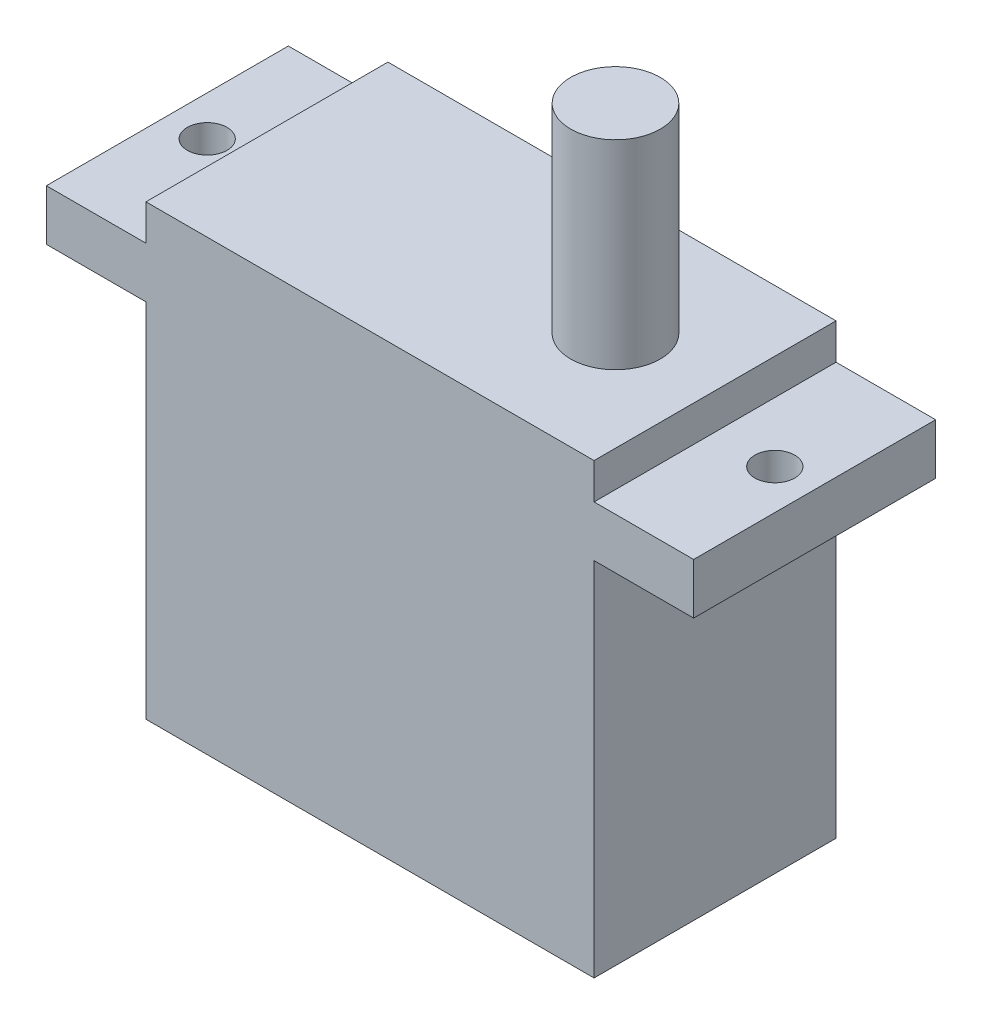
ISO-10303-21;
HEADER;
FILE_DESCRIPTION(('STEP AP214'),'2;1');
FILE_NAME('part.step','',(''),(''),'','','');
FILE_SCHEMA(('AUTOMOTIVE_DESIGN { 1 0 10303 214 1 1 1 1 }'));
ENDSEC;
DATA;
#1=APPLICATION_CONTEXT('core data for automotive mechanical design processes');
#2=APPLICATION_PROTOCOL_DEFINITION('international standard','automotive_design',2000,#1);
#3=PRODUCT_CONTEXT('',#1,'mechanical');
#4=PRODUCT('Part','Part','',(#3));
#5=PRODUCT_RELATED_PRODUCT_CATEGORY('part','',(#4));
#6=PRODUCT_DEFINITION_FORMATION('','',#4);
#7=PRODUCT_DEFINITION_CONTEXT('part definition',#1,'design');
#8=PRODUCT_DEFINITION('design','',#6,#7);
#9=PRODUCT_DEFINITION_SHAPE('','',#8);
#10=(LENGTH_UNIT() NAMED_UNIT(*) SI_UNIT(.MILLI.,.METRE.));
#11=(NAMED_UNIT(*) PLANE_ANGLE_UNIT() SI_UNIT($,.RADIAN.));
#12=(NAMED_UNIT(*) SI_UNIT($,.STERADIAN.) SOLID_ANGLE_UNIT());
#13=UNCERTAINTY_MEASURE_WITH_UNIT(LENGTH_MEASURE(1.E-05),#10,'distance_accuracy_value','');
#14=(GEOMETRIC_REPRESENTATION_CONTEXT(3) GLOBAL_UNCERTAINTY_ASSIGNED_CONTEXT((#13)) GLOBAL_UNIT_ASSIGNED_CONTEXT((#10,
#11,#12)) REPRESENTATION_CONTEXT('',''));
#15=CARTESIAN_POINT('',(0.,0.,0.));
#16=DIRECTION('',(0.,0.,1.));
#17=DIRECTION('',(1.,0.,0.));
#18=AXIS2_PLACEMENT_3D('',#15,#16,#17);
#19=CARTESIAN_POINT('',(-11.25,22.5,6.075));
#20=DIRECTION('',(1.,0.,0.));
#21=DIRECTION('',(0.,0.,-1.));
#22=AXIS2_PLACEMENT_3D('',#19,#20,#21);
#23=PLANE('',#22);
#24=DIRECTION('',(0.,0.,-1.));
#25=VECTOR('',#24,1.);
#26=CARTESIAN_POINT('',(-11.25,20.7,6.075));
#27=LINE('',#26,#25);
#28=CARTESIAN_POINT('',(-11.25,20.7,6.075));
#29=VERTEX_POINT('',#28);
#30=CARTESIAN_POINT('',(-11.25,20.7,-6.07499999999997));
#31=VERTEX_POINT('',#30);
#32=EDGE_CURVE('E147',#29,#31,#27,.T.);
#33=ORIENTED_EDGE('',*,*,#32,.F.);
#34=DIRECTION('',(0.,-1.,0.));
#35=VECTOR('',#34,1.);
#36=CARTESIAN_POINT('',(-11.25,22.5,6.075));
#37=LINE('',#36,#35);
#38=CARTESIAN_POINT('',(-11.25,22.5,6.075));
#39=VERTEX_POINT('',#38);
#40=EDGE_CURVE('E11',#39,#29,#37,.T.);
#41=ORIENTED_EDGE('',*,*,#40,.F.);
#42=DIRECTION('',(0.,0.,1.));
#43=VECTOR('',#42,1.);
#44=CARTESIAN_POINT('',(-11.25,22.5,6.075));
#45=LINE('',#44,#43);
#46=CARTESIAN_POINT('',(-11.25,22.5,-6.075));
#47=VERTEX_POINT('',#46);
#48=EDGE_CURVE('E201',#47,#39,#45,.T.);
#49=ORIENTED_EDGE('',*,*,#48,.F.);
#50=DIRECTION('',(0.,-1.,0.));
#51=VECTOR('',#50,1.);
#52=CARTESIAN_POINT('',(-11.25,22.5,-6.075));
#53=LINE('',#52,#51);
#54=EDGE_CURVE('E220',#47,#31,#53,.T.);
#55=ORIENTED_EDGE('',*,*,#54,.T.);
#56=EDGE_LOOP('',(#33,#41,#49,#55));
#57=FACE_BOUND('',#56,.T.);
#58=ADVANCED_FACE('F43',(#57),#23,.F.);
#59=CARTESIAN_POINT('',(11.25,22.5,6.075));
#60=DIRECTION('',(-1.,0.,0.));
#61=DIRECTION('',(0.,0.,1.));
#62=AXIS2_PLACEMENT_3D('',#59,#60,#61);
#63=PLANE('',#62);
#64=DIRECTION('',(0.,0.,-1.));
#65=VECTOR('',#64,1.);
#66=CARTESIAN_POINT('',(11.25,18.15,6.075));
#67=LINE('',#66,#65);
#68=CARTESIAN_POINT('',(11.25,18.15,6.075));
#69=VERTEX_POINT('',#68);
#70=CARTESIAN_POINT('',(11.25,18.15,-6.07499999999997));
#71=VERTEX_POINT('',#70);
#72=EDGE_CURVE('E178',#69,#71,#67,.T.);
#73=ORIENTED_EDGE('',*,*,#72,.F.);
#74=DIRECTION('',(0.,-1.,0.));
#75=VECTOR('',#74,1.);
#76=CARTESIAN_POINT('',(11.25,22.5,6.075));
#77=LINE('',#76,#75);
#78=CARTESIAN_POINT('',(11.25,0.,6.075));
#79=VERTEX_POINT('',#78);
#80=EDGE_CURVE('E225',#69,#79,#77,.T.);
#81=ORIENTED_EDGE('',*,*,#80,.T.);
#82=DIRECTION('',(0.,0.,-1.));
#83=VECTOR('',#82,1.);
#84=CARTESIAN_POINT('',(11.25,0.,6.075));
#85=LINE('',#84,#83);
#86=CARTESIAN_POINT('',(11.25,0.,-6.07499999999997));
#87=VERTEX_POINT('',#86);
#88=EDGE_CURVE('E215',#79,#87,#85,.T.);
#89=ORIENTED_EDGE('',*,*,#88,.T.);
#90=DIRECTION('',(0.,-1.,0.));
#91=VECTOR('',#90,1.);
#92=CARTESIAN_POINT('',(11.25,22.5,-6.07499999999997));
#93=LINE('',#92,#91);
#94=EDGE_CURVE('E222',#71,#87,#93,.T.);
#95=ORIENTED_EDGE('',*,*,#94,.F.);
#96=EDGE_LOOP('',(#73,#81,#89,#95));
#97=FACE_BOUND('',#96,.T.);
#98=ADVANCED_FACE('F232',(#97),#63,.F.);
#99=CARTESIAN_POINT('',(-11.25,18.15,6.075));
#100=VERTEX_POINT('',#99);
#101=CARTESIAN_POINT('',(-11.25,0.,6.075));
#102=VERTEX_POINT('',#101);
#103=EDGE_CURVE('E51',#100,#102,#37,.T.);
#104=ORIENTED_EDGE('',*,*,#103,.F.);
#105=DIRECTION('',(0.,0.,-1.));
#106=VECTOR('',#105,1.);
#107=CARTESIAN_POINT('',(-11.25,18.15,6.075));
#108=LINE('',#107,#106);
#109=CARTESIAN_POINT('',(-11.25,18.15,-6.075));
#110=VERTEX_POINT('',#109);
#111=EDGE_CURVE('E58',#100,#110,#108,.T.);
#112=ORIENTED_EDGE('',*,*,#111,.T.);
#113=CARTESIAN_POINT('',(-11.25,0.,-6.075));
#114=VERTEX_POINT('',#113);
#115=EDGE_CURVE('E211',#110,#114,#53,.T.);
#116=ORIENTED_EDGE('',*,*,#115,.T.);
#117=DIRECTION('',(0.,0.,1.));
#118=VECTOR('',#117,1.);
#119=CARTESIAN_POINT('',(-11.25,0.,6.075));
#120=LINE('',#119,#118);
#121=EDGE_CURVE('E192',#114,#102,#120,.T.);
#122=ORIENTED_EDGE('',*,*,#121,.T.);
#123=EDGE_LOOP('',(#104,#112,#116,#122));
#124=FACE_BOUND('',#123,.T.);
#125=ADVANCED_FACE('F45',(#124),#23,.F.);
#126=CARTESIAN_POINT('',(11.25,22.5,6.075));
#127=DIRECTION('',(0.,0.,-1.));
#128=DIRECTION('',(-1.,0.,0.));
#129=AXIS2_PLACEMENT_3D('',#126,#127,#128);
#130=PLANE('',#129);
#131=DIRECTION('',(1.,0.,0.));
#132=VECTOR('',#131,1.);
#133=CARTESIAN_POINT('',(11.25,0.,6.075));
#134=LINE('',#133,#132);
#135=EDGE_CURVE('E213',#102,#79,#134,.T.);
#136=ORIENTED_EDGE('',*,*,#135,.T.);
#137=ORIENTED_EDGE('',*,*,#80,.F.);
#138=DIRECTION('',(-1.,0.,0.));
#139=VECTOR('',#138,1.);
#140=CARTESIAN_POINT('',(16.25,18.15,6.075));
#141=LINE('',#140,#139);
#142=CARTESIAN_POINT('',(16.25,18.15,6.075));
#143=VERTEX_POINT('',#142);
#144=EDGE_CURVE('E189',#143,#69,#141,.T.);
#145=ORIENTED_EDGE('',*,*,#144,.F.);
#146=DIRECTION('',(0.,1.,0.));
#147=VECTOR('',#146,1.);
#148=CARTESIAN_POINT('',(16.25,18.15,6.075));
#149=LINE('',#148,#147);
#150=CARTESIAN_POINT('',(16.25,20.7,6.075));
#151=VERTEX_POINT('',#150);
#152=EDGE_CURVE('E174',#143,#151,#149,.T.);
#153=ORIENTED_EDGE('',*,*,#152,.T.);
#154=DIRECTION('',(-1.,0.,0.));
#155=VECTOR('',#154,1.);
#156=CARTESIAN_POINT('',(16.25,20.7,6.075));
#157=LINE('',#156,#155);
#158=CARTESIAN_POINT('',(11.25,20.7,6.075));
#159=VERTEX_POINT('',#158);
#160=EDGE_CURVE('E185',#151,#159,#157,.T.);
#161=ORIENTED_EDGE('',*,*,#160,.T.);
#162=CARTESIAN_POINT('',(11.25,22.5,6.075));
#163=VERTEX_POINT('',#162);
#164=EDGE_CURVE('E226',#163,#159,#77,.T.);
#165=ORIENTED_EDGE('',*,*,#164,.F.);
#166=DIRECTION('',(1.,0.,0.));
#167=VECTOR('',#166,1.);
#168=CARTESIAN_POINT('',(11.25,22.5,6.075));
#169=LINE('',#168,#167);
#170=EDGE_CURVE('E204',#39,#163,#169,.T.);
#171=ORIENTED_EDGE('',*,*,#170,.F.);
#172=ORIENTED_EDGE('',*,*,#40,.T.);
#173=DIRECTION('',(1.,0.,0.));
#174=VECTOR('',#173,1.);
#175=CARTESIAN_POINT('',(-16.25,20.7,6.075));
#176=LINE('',#175,#174);
#177=CARTESIAN_POINT('',(-16.25,20.7,6.075));
#178=VERTEX_POINT('',#177);
#179=EDGE_CURVE('E145',#178,#29,#176,.T.);
#180=ORIENTED_EDGE('',*,*,#179,.F.);
#181=DIRECTION('',(0.,1.,0.));
#182=VECTOR('',#181,1.);
#183=CARTESIAN_POINT('',(-16.25,18.15,6.075));
#184=LINE('',#183,#182);
#185=CARTESIAN_POINT('',(-16.25,18.15,6.075));
#186=VERTEX_POINT('',#185);
#187=EDGE_CURVE('E141',#186,#178,#184,.T.);
#188=ORIENTED_EDGE('',*,*,#187,.F.);
#189=DIRECTION('',(1.,0.,0.));
#190=VECTOR('',#189,1.);
#191=CARTESIAN_POINT('',(-16.25,18.15,6.075));
#192=LINE('',#191,#190);
#193=EDGE_CURVE('E129',#186,#100,#192,.T.);
#194=ORIENTED_EDGE('',*,*,#193,.T.);
#195=ORIENTED_EDGE('',*,*,#103,.T.);
#196=EDGE_LOOP('',(#136,#137,#145,#153,#161,#165,#171,#172,#180,#188,#194,#195));
#197=FACE_BOUND('',#196,.T.);
#198=ADVANCED_FACE('F143',(#197),#130,.F.);
#199=ORIENTED_EDGE('',*,*,#164,.T.);
#200=DIRECTION('',(0.,0.,-1.));
#201=VECTOR('',#200,1.);
#202=CARTESIAN_POINT('',(11.25,20.7,6.075));
#203=LINE('',#202,#201);
#204=CARTESIAN_POINT('',(11.25,20.7,-6.07499999999997));
#205=VERTEX_POINT('',#204);
#206=EDGE_CURVE('E173',#159,#205,#203,.T.);
#207=ORIENTED_EDGE('',*,*,#206,.T.);
#208=CARTESIAN_POINT('',(11.25,22.5,-6.07499999999997));
#209=VERTEX_POINT('',#208);
#210=EDGE_CURVE('E223',#209,#205,#93,.T.);
#211=ORIENTED_EDGE('',*,*,#210,.F.);
#212=DIRECTION('',(0.,0.,-1.));
#213=VECTOR('',#212,1.);
#214=CARTESIAN_POINT('',(11.25,22.5,6.075));
#215=LINE('',#214,#213);
#216=EDGE_CURVE('E207',#163,#209,#215,.T.);
#217=ORIENTED_EDGE('',*,*,#216,.F.);
#218=EDGE_LOOP('',(#199,#207,#211,#217));
#219=FACE_BOUND('',#218,.T.);
#220=ADVANCED_FACE('F255',(#219),#63,.F.);
#221=CARTESIAN_POINT('',(11.25,22.5,-6.07499999999997));
#222=DIRECTION('',(0.,0.,1.));
#223=DIRECTION('',(1.,0.,0.));
#224=AXIS2_PLACEMENT_3D('',#221,#222,#223);
#225=PLANE('',#224);
#226=DIRECTION('',(-1.,0.,0.));
#227=VECTOR('',#226,1.);
#228=CARTESIAN_POINT('',(11.25,0.,-6.07499999999997));
#229=LINE('',#228,#227);
#230=EDGE_CURVE('E205',#87,#114,#229,.T.);
#231=ORIENTED_EDGE('',*,*,#230,.T.);
#232=ORIENTED_EDGE('',*,*,#115,.F.);
#233=DIRECTION('',(1.,0.,0.));
#234=VECTOR('',#233,1.);
#235=CARTESIAN_POINT('',(-16.25,18.15,-6.07499999999997));
#236=LINE('',#235,#234);
#237=CARTESIAN_POINT('',(-16.25,18.15,-6.07499999999997));
#238=VERTEX_POINT('',#237);
#239=EDGE_CURVE('E136',#238,#110,#236,.T.);
#240=ORIENTED_EDGE('',*,*,#239,.F.);
#241=DIRECTION('',(0.,1.,0.));
#242=VECTOR('',#241,1.);
#243=CARTESIAN_POINT('',(-16.25,18.15,-6.07499999999997));
#244=LINE('',#243,#242);
#245=CARTESIAN_POINT('',(-16.25,20.7,-6.07499999999997));
#246=VERTEX_POINT('',#245);
#247=EDGE_CURVE('E152',#238,#246,#244,.T.);
#248=ORIENTED_EDGE('',*,*,#247,.T.);
#249=DIRECTION('',(1.,0.,0.));
#250=VECTOR('',#249,1.);
#251=CARTESIAN_POINT('',(-16.25,20.7,-6.07499999999997));
#252=LINE('',#251,#250);
#253=EDGE_CURVE('E164',#246,#31,#252,.T.);
#254=ORIENTED_EDGE('',*,*,#253,.T.);
#255=ORIENTED_EDGE('',*,*,#54,.F.);
#256=DIRECTION('',(-1.,0.,0.));
#257=VECTOR('',#256,1.);
#258=CARTESIAN_POINT('',(11.25,22.5,-6.07499999999997));
#259=LINE('',#258,#257);
#260=EDGE_CURVE('E209',#209,#47,#259,.T.);
#261=ORIENTED_EDGE('',*,*,#260,.F.);
#262=ORIENTED_EDGE('',*,*,#210,.T.);
#263=DIRECTION('',(-1.,0.,0.));
#264=VECTOR('',#263,1.);
#265=CARTESIAN_POINT('',(16.25,20.7,-6.07499999999997));
#266=LINE('',#265,#264);
#267=CARTESIAN_POINT('',(16.25,20.7,-6.07499999999997));
#268=VERTEX_POINT('',#267);
#269=EDGE_CURVE('E196',#268,#205,#266,.T.);
#270=ORIENTED_EDGE('',*,*,#269,.F.);
#271=DIRECTION('',(0.,1.,0.));
#272=VECTOR('',#271,1.);
#273=CARTESIAN_POINT('',(16.25,18.15,-6.07499999999997));
#274=LINE('',#273,#272);
#275=CARTESIAN_POINT('',(16.25,18.15,-6.07499999999997));
#276=VERTEX_POINT('',#275);
#277=EDGE_CURVE('E181',#276,#268,#274,.T.);
#278=ORIENTED_EDGE('',*,*,#277,.F.);
#279=DIRECTION('',(-1.,0.,0.));
#280=VECTOR('',#279,1.);
#281=CARTESIAN_POINT('',(16.25,18.15,-6.07499999999997));
#282=LINE('',#281,#280);
#283=EDGE_CURVE('E193',#276,#71,#282,.T.);
#284=ORIENTED_EDGE('',*,*,#283,.T.);
#285=ORIENTED_EDGE('',*,*,#94,.T.);
#286=EDGE_LOOP('',(#231,#232,#240,#248,#254,#255,#261,#262,#270,#278,#284,#285));
#287=FACE_BOUND('',#286,.T.);
#288=ADVANCED_FACE('F240',(#287),#225,.F.);
#289=CARTESIAN_POINT('',(0.,22.5,0.));
#290=DIRECTION('',(0.,1.,0.));
#291=DIRECTION('',(0.,0.,1.));
#292=AXIS2_PLACEMENT_3D('',#289,#290,#291);
#293=PLANE('',#292);
#294=CARTESIAN_POINT('',(6.25000000000009,22.5,0.));
#295=DIRECTION('',(0.,1.,0.));
#296=DIRECTION('',(0.,0.,1.));
#297=AXIS2_PLACEMENT_3D('',#294,#295,#296);
#298=CIRCLE('',#297,2.25);
#299=CARTESIAN_POINT('',(6.25000000000009,22.5,2.25));
#300=VERTEX_POINT('',#299);
#301=EDGE_CURVE('E323',#300,#300,#298,.T.);
#302=ORIENTED_EDGE('',*,*,#301,.F.);
#303=EDGE_LOOP('',(#302));
#304=FACE_BOUND('',#303,.T.);
#305=ORIENTED_EDGE('',*,*,#48,.T.);
#306=ORIENTED_EDGE('',*,*,#170,.T.);
#307=ORIENTED_EDGE('',*,*,#216,.T.);
#308=ORIENTED_EDGE('',*,*,#260,.T.);
#309=EDGE_LOOP('',(#305,#306,#307,#308));
#310=FACE_BOUND('',#309,.T.);
#311=ADVANCED_FACE('F260',(#304,#310),#293,.T.);
#312=CARTESIAN_POINT('',(0.,0.,0.));
#313=DIRECTION('',(0.,1.,0.));
#314=DIRECTION('',(0.,0.,1.));
#315=AXIS2_PLACEMENT_3D('',#312,#313,#314);
#316=PLANE('',#315);
#317=ORIENTED_EDGE('',*,*,#121,.F.);
#318=ORIENTED_EDGE('',*,*,#230,.F.);
#319=ORIENTED_EDGE('',*,*,#88,.F.);
#320=ORIENTED_EDGE('',*,*,#135,.F.);
#321=EDGE_LOOP('',(#317,#318,#319,#320));
#322=FACE_BOUND('',#321,.T.);
#323=ADVANCED_FACE('F238',(#322),#316,.F.);
#324=CARTESIAN_POINT('',(16.25,18.15,6.075));
#325=DIRECTION('',(0.,1.,0.));
#326=DIRECTION('',(0.,0.,1.));
#327=AXIS2_PLACEMENT_3D('',#324,#325,#326);
#328=PLANE('',#327);
#329=CARTESIAN_POINT('',(14.25,18.15,0.));
#330=DIRECTION('',(0.,1.,0.));
#331=DIRECTION('',(0.,0.,1.));
#332=AXIS2_PLACEMENT_3D('',#329,#330,#331);
#333=CIRCLE('',#332,1.);
#334=CARTESIAN_POINT('',(14.25,18.15,1.00000000000002));
#335=VERTEX_POINT('',#334);
#336=EDGE_CURVE('E170',#335,#335,#333,.F.);
#337=ORIENTED_EDGE('',*,*,#336,.F.);
#338=EDGE_LOOP('',(#337));
#339=FACE_BOUND('',#338,.T.);
#340=ORIENTED_EDGE('',*,*,#72,.T.);
#341=ORIENTED_EDGE('',*,*,#283,.F.);
#342=DIRECTION('',(0.,0.,-1.));
#343=VECTOR('',#342,1.);
#344=CARTESIAN_POINT('',(16.25,18.15,6.075));
#345=LINE('',#344,#343);
#346=EDGE_CURVE('E183',#143,#276,#345,.T.);
#347=ORIENTED_EDGE('',*,*,#346,.F.);
#348=ORIENTED_EDGE('',*,*,#144,.T.);
#349=EDGE_LOOP('',(#340,#341,#347,#348));
#350=FACE_BOUND('',#349,.T.);
#351=ADVANCED_FACE('F244',(#339,#350),#328,.F.);
#352=CARTESIAN_POINT('',(16.25,20.7,6.075));
#353=DIRECTION('',(0.,1.,0.));
#354=DIRECTION('',(0.,0.,1.));
#355=AXIS2_PLACEMENT_3D('',#352,#353,#354);
#356=PLANE('',#355);
#357=CARTESIAN_POINT('',(14.25,20.7,0.));
#358=DIRECTION('',(0.,1.,0.));
#359=DIRECTION('',(0.,0.,1.));
#360=AXIS2_PLACEMENT_3D('',#357,#358,#359);
#361=CIRCLE('',#360,1.);
#362=CARTESIAN_POINT('',(14.25,20.7,1.00000000000002));
#363=VERTEX_POINT('',#362);
#364=EDGE_CURVE('E163',#363,#363,#361,.T.);
#365=ORIENTED_EDGE('',*,*,#364,.F.);
#366=EDGE_LOOP('',(#365));
#367=FACE_BOUND('',#366,.T.);
#368=ORIENTED_EDGE('',*,*,#206,.F.);
#369=ORIENTED_EDGE('',*,*,#160,.F.);
#370=DIRECTION('',(0.,0.,-1.));
#371=VECTOR('',#370,1.);
#372=CARTESIAN_POINT('',(16.25,20.7,6.075));
#373=LINE('',#372,#371);
#374=EDGE_CURVE('E177',#151,#268,#373,.T.);
#375=ORIENTED_EDGE('',*,*,#374,.T.);
#376=ORIENTED_EDGE('',*,*,#269,.T.);
#377=EDGE_LOOP('',(#368,#369,#375,#376));
#378=FACE_BOUND('',#377,.T.);
#379=ADVANCED_FACE('F253',(#367,#378),#356,.T.);
#380=CARTESIAN_POINT('',(16.25,0.,0.));
#381=DIRECTION('',(-1.,0.,0.));
#382=DIRECTION('',(0.,0.,1.));
#383=AXIS2_PLACEMENT_3D('',#380,#381,#382);
#384=PLANE('',#383);
#385=ORIENTED_EDGE('',*,*,#152,.F.);
#386=ORIENTED_EDGE('',*,*,#346,.T.);
#387=ORIENTED_EDGE('',*,*,#277,.T.);
#388=ORIENTED_EDGE('',*,*,#374,.F.);
#389=EDGE_LOOP('',(#385,#386,#387,#388));
#390=FACE_BOUND('',#389,.T.);
#391=ADVANCED_FACE('F250',(#390),#384,.F.);
#392=CARTESIAN_POINT('',(14.25,15.3215728752538,0.));
#393=DIRECTION('',(0.,1.,0.));
#394=DIRECTION('',(0.,0.,1.));
#395=AXIS2_PLACEMENT_3D('',#392,#393,#394);
#396=CYLINDRICAL_SURFACE('',#395,1.);
#397=ORIENTED_EDGE('',*,*,#336,.T.);
#398=EDGE_LOOP('',(#397));
#399=FACE_BOUND('',#398,.T.);
#400=ORIENTED_EDGE('',*,*,#364,.T.);
#401=EDGE_LOOP('',(#400));
#402=FACE_BOUND('',#401,.T.);
#403=ADVANCED_FACE('F295',(#399,#402),#396,.F.);
#404=CARTESIAN_POINT('',(-16.25,20.7,6.075));
#405=DIRECTION('',(0.,-1.,0.));
#406=DIRECTION('',(0.,0.,-1.));
#407=AXIS2_PLACEMENT_3D('',#404,#405,#406);
#408=PLANE('',#407);
#409=CARTESIAN_POINT('',(-14.25,20.7,0.));
#410=DIRECTION('',(0.,-1.,0.));
#411=DIRECTION('',(0.,0.,1.));
#412=AXIS2_PLACEMENT_3D('',#409,#410,#411);
#413=CIRCLE('',#412,1.);
#414=CARTESIAN_POINT('',(-14.25,20.7,1.00000000000002));
#415=VERTEX_POINT('',#414);
#416=EDGE_CURVE('E322',#415,#415,#413,.T.);
#417=ORIENTED_EDGE('',*,*,#416,.T.);
#418=EDGE_LOOP('',(#417));
#419=FACE_BOUND('',#418,.T.);
#420=ORIENTED_EDGE('',*,*,#32,.T.);
#421=ORIENTED_EDGE('',*,*,#253,.F.);
#422=DIRECTION('',(0.,0.,-1.));
#423=VECTOR('',#422,1.);
#424=CARTESIAN_POINT('',(-16.25,20.7,6.075));
#425=LINE('',#424,#423);
#426=EDGE_CURVE('E137',#178,#246,#425,.T.);
#427=ORIENTED_EDGE('',*,*,#426,.F.);
#428=ORIENTED_EDGE('',*,*,#179,.T.);
#429=EDGE_LOOP('',(#420,#421,#427,#428));
#430=FACE_BOUND('',#429,.T.);
#431=ADVANCED_FACE('F264',(#419,#430),#408,.F.);
#432=CARTESIAN_POINT('',(-16.25,18.15,6.075));
#433=DIRECTION('',(0.,-1.,0.));
#434=DIRECTION('',(0.,0.,-1.));
#435=AXIS2_PLACEMENT_3D('',#432,#433,#434);
#436=PLANE('',#435);
#437=CARTESIAN_POINT('',(-14.25,18.15,0.));
#438=DIRECTION('',(0.,1.,0.));
#439=DIRECTION('',(0.,0.,1.));
#440=AXIS2_PLACEMENT_3D('',#437,#438,#439);
#441=CIRCLE('',#440,1.);
#442=CARTESIAN_POINT('',(-14.25,18.15,1.00000000000002));
#443=VERTEX_POINT('',#442);
#444=EDGE_CURVE('E159',#443,#443,#441,.T.);
#445=ORIENTED_EDGE('',*,*,#444,.T.);
#446=EDGE_LOOP('',(#445));
#447=FACE_BOUND('',#446,.T.);
#448=ORIENTED_EDGE('',*,*,#111,.F.);
#449=ORIENTED_EDGE('',*,*,#193,.F.);
#450=DIRECTION('',(0.,0.,-1.));
#451=VECTOR('',#450,1.);
#452=CARTESIAN_POINT('',(-16.25,18.15,6.075));
#453=LINE('',#452,#451);
#454=EDGE_CURVE('E134',#186,#238,#453,.T.);
#455=ORIENTED_EDGE('',*,*,#454,.T.);
#456=ORIENTED_EDGE('',*,*,#239,.T.);
#457=EDGE_LOOP('',(#448,#449,#455,#456));
#458=FACE_BOUND('',#457,.T.);
#459=ADVANCED_FACE('F131',(#447,#458),#436,.T.);
#460=CARTESIAN_POINT('',(-16.25,0.,0.));
#461=DIRECTION('',(1.,0.,0.));
#462=DIRECTION('',(0.,0.,1.));
#463=AXIS2_PLACEMENT_3D('',#460,#461,#462);
#464=PLANE('',#463);
#465=ORIENTED_EDGE('',*,*,#187,.T.);
#466=ORIENTED_EDGE('',*,*,#426,.T.);
#467=ORIENTED_EDGE('',*,*,#247,.F.);
#468=ORIENTED_EDGE('',*,*,#454,.F.);
#469=EDGE_LOOP('',(#465,#466,#467,#468));
#470=FACE_BOUND('',#469,.T.);
#471=ADVANCED_FACE('F150',(#470),#464,.F.);
#472=CARTESIAN_POINT('',(-14.25,15.3215728752538,0.));
#473=DIRECTION('',(0.,1.,0.));
#474=DIRECTION('',(0.,0.,1.));
#475=AXIS2_PLACEMENT_3D('',#472,#473,#474);
#476=CYLINDRICAL_SURFACE('',#475,1.);
#477=ORIENTED_EDGE('',*,*,#444,.F.);
#478=EDGE_LOOP('',(#477));
#479=FACE_BOUND('',#478,.T.);
#480=ORIENTED_EDGE('',*,*,#416,.F.);
#481=EDGE_LOOP('',(#480));
#482=FACE_BOUND('',#481,.T.);
#483=ADVANCED_FACE('F306',(#479,#482),#476,.F.);
#484=CARTESIAN_POINT('',(6.25000000000009,32.5,0.));
#485=DIRECTION('',(0.,-1.,0.));
#486=DIRECTION('',(0.,0.,-1.));
#487=AXIS2_PLACEMENT_3D('',#484,#485,#486);
#488=CYLINDRICAL_SURFACE('',#487,2.25);
#489=CARTESIAN_POINT('',(6.25000000000009,32.5,0.));
#490=DIRECTION('',(0.,1.,0.));
#491=DIRECTION('',(0.,0.,1.));
#492=AXIS2_PLACEMENT_3D('',#489,#490,#491);
#493=CIRCLE('',#492,2.25);
#494=CARTESIAN_POINT('',(6.25000000000009,32.5,2.25));
#495=VERTEX_POINT('',#494);
#496=EDGE_CURVE('E321',#495,#495,#493,.T.);
#497=ORIENTED_EDGE('',*,*,#496,.F.);
#498=EDGE_LOOP('',(#497));
#499=FACE_BOUND('',#498,.T.);
#500=ORIENTED_EDGE('',*,*,#301,.T.);
#501=EDGE_LOOP('',(#500));
#502=FACE_BOUND('',#501,.T.);
#503=ADVANCED_FACE('F309',(#499,#502),#488,.T.);
#504=CARTESIAN_POINT('',(6.25000000000009,32.5,0.));
#505=DIRECTION('',(0.,1.,0.));
#506=DIRECTION('',(0.,0.,1.));
#507=AXIS2_PLACEMENT_3D('',#504,#505,#506);
#508=PLANE('',#507);
#509=ORIENTED_EDGE('',*,*,#496,.T.);
#510=EDGE_LOOP('',(#509));
#511=FACE_BOUND('',#510,.T.);
#512=ADVANCED_FACE('F313',(#511),#508,.T.);
#513=CLOSED_SHELL('',(#58,#98,#125,#198,#220,#288,#311,#323,#351,#379,#391,#403,#431,#459,#471,
#483,#503,#512));
#514=MANIFOLD_SOLID_BREP('B2',#513);
#515=ADVANCED_BREP_SHAPE_REPRESENTATION('',(#18,#514),#14);
#516=SHAPE_DEFINITION_REPRESENTATION(#9,#515);
ENDSEC;
END-ISO-10303-21;
